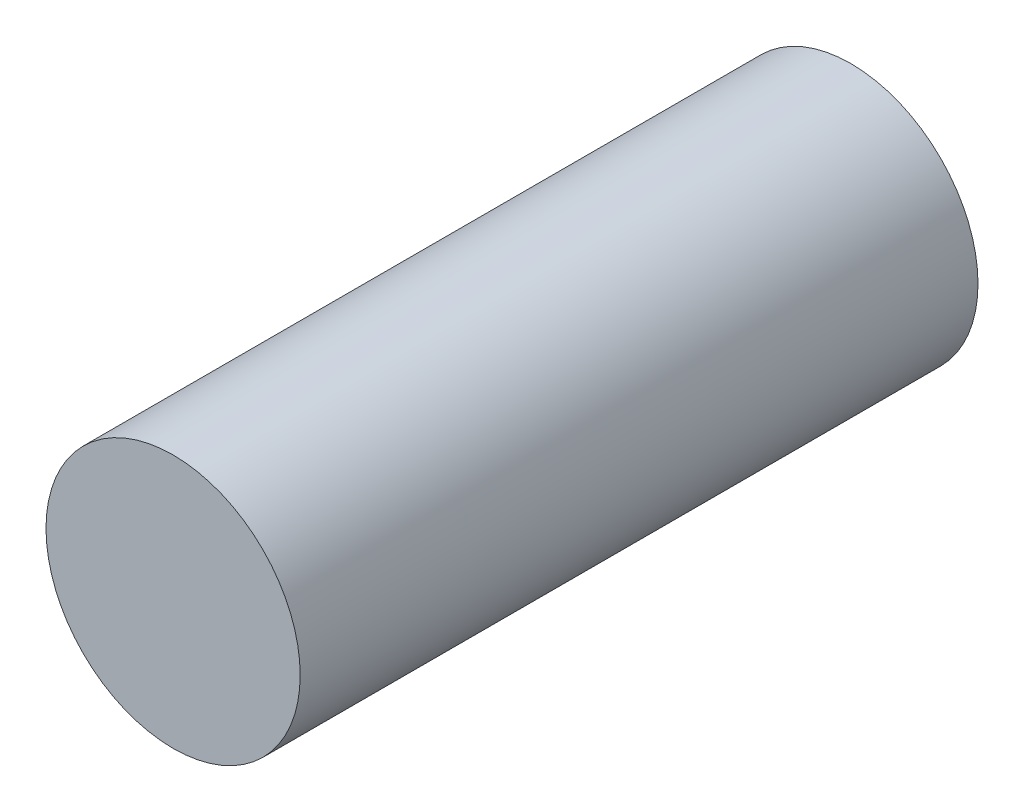
ISO-10303-21;
HEADER;
FILE_DESCRIPTION(('STEP AP214'),'2;1');
FILE_NAME('part.step','',(''),(''),'','','');
FILE_SCHEMA(('AUTOMOTIVE_DESIGN { 1 0 10303 214 1 1 1 1 }'));
ENDSEC;
DATA;
#1=APPLICATION_CONTEXT('core data for automotive mechanical design processes');
#2=APPLICATION_PROTOCOL_DEFINITION('international standard','automotive_design',2000,#1);
#3=PRODUCT_CONTEXT('',#1,'mechanical');
#4=PRODUCT('Part','Part','',(#3));
#5=PRODUCT_RELATED_PRODUCT_CATEGORY('part','',(#4));
#6=PRODUCT_DEFINITION_FORMATION('','',#4);
#7=PRODUCT_DEFINITION_CONTEXT('part definition',#1,'design');
#8=PRODUCT_DEFINITION('design','',#6,#7);
#9=PRODUCT_DEFINITION_SHAPE('','',#8);
#10=(LENGTH_UNIT() NAMED_UNIT(*) SI_UNIT(.MILLI.,.METRE.));
#11=(NAMED_UNIT(*) PLANE_ANGLE_UNIT() SI_UNIT($,.RADIAN.));
#12=(NAMED_UNIT(*) SI_UNIT($,.STERADIAN.) SOLID_ANGLE_UNIT());
#13=UNCERTAINTY_MEASURE_WITH_UNIT(LENGTH_MEASURE(1.E-05),#10,'distance_accuracy_value','');
#14=(GEOMETRIC_REPRESENTATION_CONTEXT(3) GLOBAL_UNCERTAINTY_ASSIGNED_CONTEXT((#13)) GLOBAL_UNIT_ASSIGNED_CONTEXT((#10,
#11,#12)) REPRESENTATION_CONTEXT('',''));
#15=CARTESIAN_POINT('',(0.,0.,0.));
#16=DIRECTION('',(0.,0.,1.));
#17=DIRECTION('',(1.,0.,0.));
#18=AXIS2_PLACEMENT_3D('',#15,#16,#17);
#19=CARTESIAN_POINT('',(0.,0.,800.));
#20=DIRECTION('',(0.,0.,-1.));
#21=DIRECTION('',(-1.,0.,0.));
#22=AXIS2_PLACEMENT_3D('',#19,#20,#21);
#23=CYLINDRICAL_SURFACE('',#22,150.);
#24=CARTESIAN_POINT('',(0.,0.,800.));
#25=DIRECTION('',(0.,0.,1.));
#26=DIRECTION('',(1.,0.,0.));
#27=AXIS2_PLACEMENT_3D('',#24,#25,#26);
#28=CIRCLE('',#27,150.);
#29=CARTESIAN_POINT('',(150.,0.,800.));
#30=VERTEX_POINT('',#29);
#31=EDGE_CURVE('E10',#30,#30,#28,.T.);
#32=ORIENTED_EDGE('',*,*,#31,.F.);
#33=EDGE_LOOP('',(#32));
#34=FACE_BOUND('',#33,.T.);
#35=CARTESIAN_POINT('',(0.,0.,0.));
#36=DIRECTION('',(0.,0.,1.));
#37=DIRECTION('',(1.,0.,0.));
#38=AXIS2_PLACEMENT_3D('',#35,#36,#37);
#39=CIRCLE('',#38,150.);
#40=CARTESIAN_POINT('',(150.,0.,0.));
#41=VERTEX_POINT('',#40);
#42=EDGE_CURVE('E42',#41,#41,#39,.T.);
#43=ORIENTED_EDGE('',*,*,#42,.T.);
#44=EDGE_LOOP('',(#43));
#45=FACE_BOUND('',#44,.T.);
#46=ADVANCED_FACE('F39',(#34,#45),#23,.T.);
#47=CARTESIAN_POINT('',(0.,0.,800.));
#48=DIRECTION('',(0.,0.,1.));
#49=DIRECTION('',(1.,0.,0.));
#50=AXIS2_PLACEMENT_3D('',#47,#48,#49);
#51=PLANE('',#50);
#52=ORIENTED_EDGE('',*,*,#31,.T.);
#53=EDGE_LOOP('',(#52));
#54=FACE_BOUND('',#53,.T.);
#55=ADVANCED_FACE('F54',(#54),#51,.T.);
#56=CARTESIAN_POINT('',(0.,0.,0.));
#57=DIRECTION('',(0.,0.,1.));
#58=DIRECTION('',(1.,0.,0.));
#59=AXIS2_PLACEMENT_3D('',#56,#57,#58);
#60=PLANE('',#59);
#61=ORIENTED_EDGE('',*,*,#42,.F.);
#62=EDGE_LOOP('',(#61));
#63=FACE_BOUND('',#62,.T.);
#64=ADVANCED_FACE('F52',(#63),#60,.F.);
#65=CLOSED_SHELL('',(#46,#55,#64));
#66=MANIFOLD_SOLID_BREP('B2',#65);
#67=ADVANCED_BREP_SHAPE_REPRESENTATION('',(#18,#66),#14);
#68=SHAPE_DEFINITION_REPRESENTATION(#9,#67);
ENDSEC;
END-ISO-10303-21;
